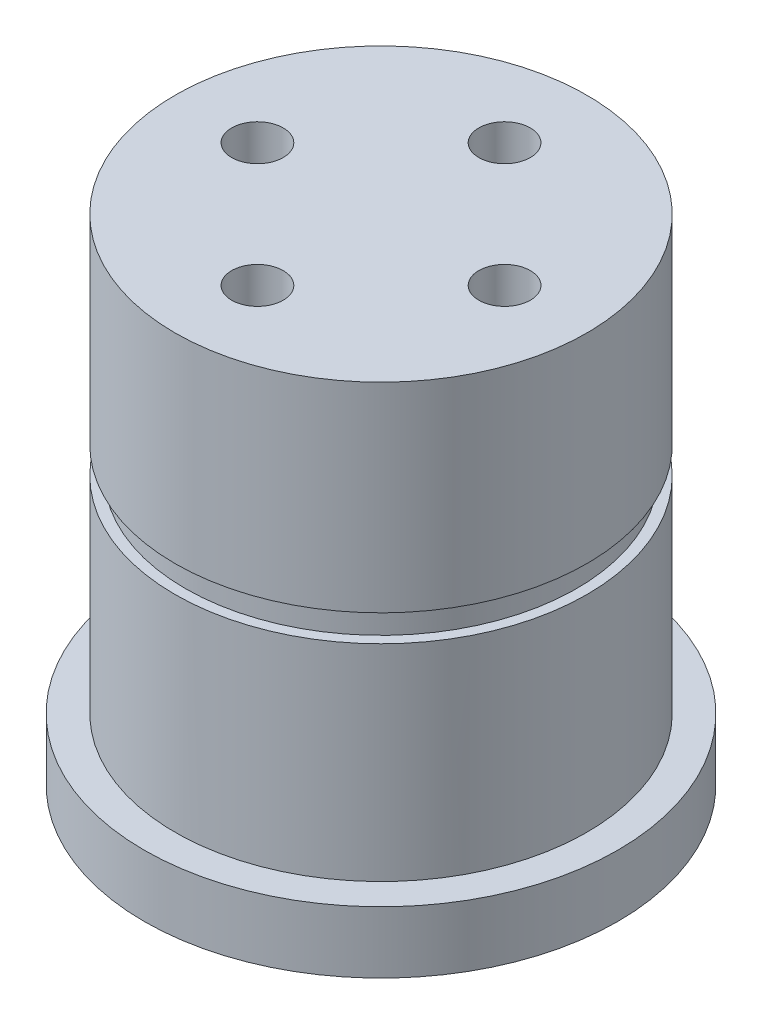
ISO-10303-21;
HEADER;
FILE_DESCRIPTION(('STEP AP214'),'2;1');
FILE_NAME('part.step','',(''),(''),'','','');
FILE_SCHEMA(('AUTOMOTIVE_DESIGN { 1 0 10303 214 1 1 1 1 }'));
ENDSEC;
DATA;
#1=APPLICATION_CONTEXT('core data for automotive mechanical design processes');
#2=APPLICATION_PROTOCOL_DEFINITION('international standard','automotive_design',2000,#1);
#3=PRODUCT_CONTEXT('',#1,'mechanical');
#4=PRODUCT('Part','Part','',(#3));
#5=PRODUCT_RELATED_PRODUCT_CATEGORY('part','',(#4));
#6=PRODUCT_DEFINITION_FORMATION('','',#4);
#7=PRODUCT_DEFINITION_CONTEXT('part definition',#1,'design');
#8=PRODUCT_DEFINITION('design','',#6,#7);
#9=PRODUCT_DEFINITION_SHAPE('','',#8);
#10=(LENGTH_UNIT() NAMED_UNIT(*) SI_UNIT(.MILLI.,.METRE.));
#11=(NAMED_UNIT(*) PLANE_ANGLE_UNIT() SI_UNIT($,.RADIAN.));
#12=(NAMED_UNIT(*) SI_UNIT($,.STERADIAN.) SOLID_ANGLE_UNIT());
#13=UNCERTAINTY_MEASURE_WITH_UNIT(LENGTH_MEASURE(1.E-05),#10,'distance_accuracy_value','');
#14=(GEOMETRIC_REPRESENTATION_CONTEXT(3) GLOBAL_UNCERTAINTY_ASSIGNED_CONTEXT((#13)) GLOBAL_UNIT_ASSIGNED_CONTEXT((#10,
#11,#12)) REPRESENTATION_CONTEXT('',''));
#15=CARTESIAN_POINT('',(0.,0.,0.));
#16=DIRECTION('',(0.,0.,1.));
#17=DIRECTION('',(1.,0.,0.));
#18=AXIS2_PLACEMENT_3D('',#15,#16,#17);
#19=CARTESIAN_POINT('',(0.,24.,0.));
#20=DIRECTION('',(0.,-1.,0.));
#21=DIRECTION('',(0.,0.,-1.));
#22=AXIS2_PLACEMENT_3D('',#19,#20,#21);
#23=CYLINDRICAL_SURFACE('',#22,10.);
#24=CARTESIAN_POINT('',(0.,14.3,0.));
#25=DIRECTION('',(0.,1.,0.));
#26=DIRECTION('',(0.,0.,1.));
#27=AXIS2_PLACEMENT_3D('',#24,#25,#26);
#28=CIRCLE('',#27,10.);
#29=CARTESIAN_POINT('',(0.,14.3,10.));
#30=VERTEX_POINT('',#29);
#31=EDGE_CURVE('E124',#30,#30,#28,.T.);
#32=ORIENTED_EDGE('',*,*,#31,.T.);
#33=EDGE_LOOP('',(#32));
#34=FACE_BOUND('',#33,.T.);
#35=CARTESIAN_POINT('',(0.,24.,0.));
#36=DIRECTION('',(0.,1.,0.));
#37=DIRECTION('',(0.,0.,1.));
#38=AXIS2_PLACEMENT_3D('',#35,#36,#37);
#39=CIRCLE('',#38,10.);
#40=CARTESIAN_POINT('',(0.,24.,10.));
#41=VERTEX_POINT('',#40);
#42=EDGE_CURVE('E47',#41,#41,#39,.T.);
#43=ORIENTED_EDGE('',*,*,#42,.F.);
#44=EDGE_LOOP('',(#43));
#45=FACE_BOUND('',#44,.T.);
#46=ADVANCED_FACE('F40',(#34,#45),#23,.T.);
#47=CARTESIAN_POINT('',(0.,24.,0.));
#48=DIRECTION('',(0.,1.,0.));
#49=DIRECTION('',(0.,0.,1.));
#50=AXIS2_PLACEMENT_3D('',#47,#48,#49);
#51=PLANE('',#50);
#52=CARTESIAN_POINT('',(0.,24.,-6.));
#53=DIRECTION('',(0.,1.,0.));
#54=DIRECTION('',(0.,0.,1.));
#55=AXIS2_PLACEMENT_3D('',#52,#53,#54);
#56=CIRCLE('',#55,1.24999999999999);
#57=CARTESIAN_POINT('',(0.,24.,-4.75000000000001));
#58=VERTEX_POINT('',#57);
#59=EDGE_CURVE('E71',#58,#58,#56,.T.);
#60=ORIENTED_EDGE('',*,*,#59,.F.);
#61=EDGE_LOOP('',(#60));
#62=FACE_BOUND('',#61,.T.);
#63=CARTESIAN_POINT('',(6.,24.,0.));
#64=DIRECTION('',(0.,1.,0.));
#65=DIRECTION('',(0.,0.,1.));
#66=AXIS2_PLACEMENT_3D('',#63,#64,#65);
#67=CIRCLE('',#66,1.24999999999999);
#68=CARTESIAN_POINT('',(6.,24.,1.24999999999999));
#69=VERTEX_POINT('',#68);
#70=EDGE_CURVE('E70',#69,#69,#67,.T.);
#71=ORIENTED_EDGE('',*,*,#70,.F.);
#72=EDGE_LOOP('',(#71));
#73=FACE_BOUND('',#72,.T.);
#74=CARTESIAN_POINT('',(0.,24.,6.));
#75=DIRECTION('',(0.,1.,0.));
#76=DIRECTION('',(0.,0.,1.));
#77=AXIS2_PLACEMENT_3D('',#74,#75,#76);
#78=CIRCLE('',#77,1.24999999999999);
#79=CARTESIAN_POINT('',(0.,24.,7.24999999999999));
#80=VERTEX_POINT('',#79);
#81=EDGE_CURVE('E83',#80,#80,#78,.T.);
#82=ORIENTED_EDGE('',*,*,#81,.F.);
#83=EDGE_LOOP('',(#82));
#84=FACE_BOUND('',#83,.T.);
#85=CARTESIAN_POINT('',(-6.,24.,0.));
#86=DIRECTION('',(0.,1.,0.));
#87=DIRECTION('',(0.,0.,1.));
#88=AXIS2_PLACEMENT_3D('',#85,#86,#87);
#89=CIRCLE('',#88,1.24999999999999);
#90=CARTESIAN_POINT('',(-6.,24.,1.24999999999999));
#91=VERTEX_POINT('',#90);
#92=EDGE_CURVE('E89',#91,#91,#89,.T.);
#93=ORIENTED_EDGE('',*,*,#92,.F.);
#94=EDGE_LOOP('',(#93));
#95=FACE_BOUND('',#94,.T.);
#96=ORIENTED_EDGE('',*,*,#42,.T.);
#97=EDGE_LOOP('',(#96));
#98=FACE_BOUND('',#97,.T.);
#99=ADVANCED_FACE('F97',(#62,#73,#84,#95,#98),#51,.T.);
#100=CARTESIAN_POINT('',(-6.,15.5,0.));
#101=DIRECTION('',(0.,1.,0.));
#102=DIRECTION('',(0.,0.,1.));
#103=AXIS2_PLACEMENT_3D('',#100,#101,#102);
#104=CONICAL_SURFACE('',#103,1.24999999999999,1.02974425867665);
#105=CARTESIAN_POINT('',(-6.,14.7489242262156,0.));
#106=VERTEX_POINT('',#105);
#107=VERTEX_LOOP('',#106);
#108=FACE_BOUND('',#107,.T.);
#109=CARTESIAN_POINT('',(-6.,15.5,0.));
#110=DIRECTION('',(0.,1.,0.));
#111=DIRECTION('',(0.,0.,1.));
#112=AXIS2_PLACEMENT_3D('',#109,#110,#111);
#113=CIRCLE('',#112,1.24999999999999);
#114=CARTESIAN_POINT('',(-6.,15.5,1.24999999999999));
#115=VERTEX_POINT('',#114);
#116=EDGE_CURVE('E92',#115,#115,#113,.T.);
#117=ORIENTED_EDGE('',*,*,#116,.T.);
#118=EDGE_LOOP('',(#117));
#119=FACE_BOUND('',#118,.T.);
#120=ADVANCED_FACE('F105',(#108,#119),#104,.F.);
#121=CARTESIAN_POINT('',(-6.,24.,0.));
#122=DIRECTION('',(0.,1.,0.));
#123=DIRECTION('',(0.,0.,1.));
#124=AXIS2_PLACEMENT_3D('',#121,#122,#123);
#125=CYLINDRICAL_SURFACE('',#124,1.24999999999999);
#126=ORIENTED_EDGE('',*,*,#116,.F.);
#127=EDGE_LOOP('',(#126));
#128=FACE_BOUND('',#127,.T.);
#129=ORIENTED_EDGE('',*,*,#92,.T.);
#130=EDGE_LOOP('',(#129));
#131=FACE_BOUND('',#130,.T.);
#132=ADVANCED_FACE('F154',(#128,#131),#125,.F.);
#133=CARTESIAN_POINT('',(0.,15.5,6.));
#134=DIRECTION('',(0.,1.,0.));
#135=DIRECTION('',(0.,0.,1.));
#136=AXIS2_PLACEMENT_3D('',#133,#134,#135);
#137=CONICAL_SURFACE('',#136,1.24999999999999,1.02974425867665);
#138=CARTESIAN_POINT('',(0.,14.7489242262156,6.));
#139=VERTEX_POINT('',#138);
#140=VERTEX_LOOP('',#139);
#141=FACE_BOUND('',#140,.T.);
#142=CARTESIAN_POINT('',(0.,15.5,6.));
#143=DIRECTION('',(0.,1.,0.));
#144=DIRECTION('',(0.,0.,1.));
#145=AXIS2_PLACEMENT_3D('',#142,#143,#144);
#146=CIRCLE('',#145,1.24999999999999);
#147=CARTESIAN_POINT('',(0.,15.5,7.24999999999999));
#148=VERTEX_POINT('',#147);
#149=EDGE_CURVE('E86',#148,#148,#146,.T.);
#150=ORIENTED_EDGE('',*,*,#149,.T.);
#151=EDGE_LOOP('',(#150));
#152=FACE_BOUND('',#151,.T.);
#153=ADVANCED_FACE('F157',(#141,#152),#137,.F.);
#154=CARTESIAN_POINT('',(0.,24.,6.));
#155=DIRECTION('',(0.,1.,0.));
#156=DIRECTION('',(0.,0.,1.));
#157=AXIS2_PLACEMENT_3D('',#154,#155,#156);
#158=CYLINDRICAL_SURFACE('',#157,1.24999999999999);
#159=ORIENTED_EDGE('',*,*,#149,.F.);
#160=EDGE_LOOP('',(#159));
#161=FACE_BOUND('',#160,.T.);
#162=ORIENTED_EDGE('',*,*,#81,.T.);
#163=EDGE_LOOP('',(#162));
#164=FACE_BOUND('',#163,.T.);
#165=ADVANCED_FACE('F161',(#161,#164),#158,.F.);
#166=CARTESIAN_POINT('',(6.,15.5,0.));
#167=DIRECTION('',(0.,1.,0.));
#168=DIRECTION('',(0.,0.,1.));
#169=AXIS2_PLACEMENT_3D('',#166,#167,#168);
#170=CONICAL_SURFACE('',#169,1.24999999999999,1.02974425867665);
#171=CARTESIAN_POINT('',(6.,14.7489242262156,0.));
#172=VERTEX_POINT('',#171);
#173=VERTEX_LOOP('',#172);
#174=FACE_BOUND('',#173,.T.);
#175=CARTESIAN_POINT('',(6.,15.5,0.));
#176=DIRECTION('',(0.,1.,0.));
#177=DIRECTION('',(0.,0.,1.));
#178=AXIS2_PLACEMENT_3D('',#175,#176,#177);
#179=CIRCLE('',#178,1.24999999999999);
#180=CARTESIAN_POINT('',(6.,15.5,1.24999999999999));
#181=VERTEX_POINT('',#180);
#182=EDGE_CURVE('E74',#181,#181,#179,.T.);
#183=ORIENTED_EDGE('',*,*,#182,.T.);
#184=EDGE_LOOP('',(#183));
#185=FACE_BOUND('',#184,.T.);
#186=ADVANCED_FACE('F164',(#174,#185),#170,.F.);
#187=CARTESIAN_POINT('',(6.,24.,0.));
#188=DIRECTION('',(0.,1.,0.));
#189=DIRECTION('',(0.,0.,1.));
#190=AXIS2_PLACEMENT_3D('',#187,#188,#189);
#191=CYLINDRICAL_SURFACE('',#190,1.24999999999999);
#192=ORIENTED_EDGE('',*,*,#182,.F.);
#193=EDGE_LOOP('',(#192));
#194=FACE_BOUND('',#193,.T.);
#195=ORIENTED_EDGE('',*,*,#70,.T.);
#196=EDGE_LOOP('',(#195));
#197=FACE_BOUND('',#196,.T.);
#198=ADVANCED_FACE('F64',(#194,#197),#191,.F.);
#199=CARTESIAN_POINT('',(0.,15.5,-6.));
#200=DIRECTION('',(0.,1.,0.));
#201=DIRECTION('',(0.,0.,1.));
#202=AXIS2_PLACEMENT_3D('',#199,#200,#201);
#203=CONICAL_SURFACE('',#202,1.24999999999999,1.02974425867665);
#204=CARTESIAN_POINT('',(0.,14.7489242262156,-6.));
#205=VERTEX_POINT('',#204);
#206=VERTEX_LOOP('',#205);
#207=FACE_BOUND('',#206,.T.);
#208=CARTESIAN_POINT('',(0.,15.5,-6.));
#209=DIRECTION('',(0.,1.,0.));
#210=DIRECTION('',(0.,0.,1.));
#211=AXIS2_PLACEMENT_3D('',#208,#209,#210);
#212=CIRCLE('',#211,1.24999999999999);
#213=CARTESIAN_POINT('',(0.,15.5,-4.75000000000001));
#214=VERTEX_POINT('',#213);
#215=EDGE_CURVE('E68',#214,#214,#212,.T.);
#216=ORIENTED_EDGE('',*,*,#215,.T.);
#217=EDGE_LOOP('',(#216));
#218=FACE_BOUND('',#217,.T.);
#219=ADVANCED_FACE('F60',(#207,#218),#203,.F.);
#220=CARTESIAN_POINT('',(0.,24.,-6.));
#221=DIRECTION('',(0.,1.,0.));
#222=DIRECTION('',(0.,0.,1.));
#223=AXIS2_PLACEMENT_3D('',#220,#221,#222);
#224=CYLINDRICAL_SURFACE('',#223,1.24999999999999);
#225=ORIENTED_EDGE('',*,*,#215,.F.);
#226=EDGE_LOOP('',(#225));
#227=FACE_BOUND('',#226,.T.);
#228=ORIENTED_EDGE('',*,*,#59,.T.);
#229=EDGE_LOOP('',(#228));
#230=FACE_BOUND('',#229,.T.);
#231=ADVANCED_FACE('F63',(#227,#230),#224,.F.);
#232=CARTESIAN_POINT('',(0.,14.3,0.));
#233=DIRECTION('',(0.,1.,0.));
#234=DIRECTION('',(0.,0.,1.));
#235=AXIS2_PLACEMENT_3D('',#232,#233,#234);
#236=PLANE('',#235);
#237=ORIENTED_EDGE('',*,*,#31,.F.);
#238=EDGE_LOOP('',(#237));
#239=FACE_BOUND('',#238,.T.);
#240=CARTESIAN_POINT('',(0.,14.3,0.));
#241=DIRECTION('',(0.,1.,0.));
#242=DIRECTION('',(0.,0.,1.));
#243=AXIS2_PLACEMENT_3D('',#240,#241,#242);
#244=CIRCLE('',#243,9.5);
#245=CARTESIAN_POINT('',(0.,14.3,9.5));
#246=VERTEX_POINT('',#245);
#247=EDGE_CURVE('E125',#246,#246,#244,.T.);
#248=ORIENTED_EDGE('',*,*,#247,.T.);
#249=EDGE_LOOP('',(#248));
#250=FACE_BOUND('',#249,.T.);
#251=ADVANCED_FACE('F173',(#239,#250),#236,.F.);
#252=CARTESIAN_POINT('',(0.,13.,0.));
#253=DIRECTION('',(0.,1.,0.));
#254=DIRECTION('',(0.,0.,1.));
#255=AXIS2_PLACEMENT_3D('',#252,#253,#254);
#256=PLANE('',#255);
#257=CARTESIAN_POINT('',(0.,13.,0.));
#258=DIRECTION('',(0.,1.,0.));
#259=DIRECTION('',(0.,0.,1.));
#260=AXIS2_PLACEMENT_3D('',#257,#258,#259);
#261=CIRCLE('',#260,10.);
#262=CARTESIAN_POINT('',(0.,13.,10.));
#263=VERTEX_POINT('',#262);
#264=EDGE_CURVE('E122',#263,#263,#261,.T.);
#265=ORIENTED_EDGE('',*,*,#264,.T.);
#266=EDGE_LOOP('',(#265));
#267=FACE_BOUND('',#266,.T.);
#268=CARTESIAN_POINT('',(0.,13.,0.));
#269=DIRECTION('',(0.,1.,0.));
#270=DIRECTION('',(0.,0.,1.));
#271=AXIS2_PLACEMENT_3D('',#268,#269,#270);
#272=CIRCLE('',#271,9.5);
#273=CARTESIAN_POINT('',(0.,13.,9.5));
#274=VERTEX_POINT('',#273);
#275=EDGE_CURVE('E130',#274,#274,#272,.T.);
#276=ORIENTED_EDGE('',*,*,#275,.F.);
#277=EDGE_LOOP('',(#276));
#278=FACE_BOUND('',#277,.T.);
#279=ADVANCED_FACE('F148',(#267,#278),#256,.T.);
#280=CARTESIAN_POINT('',(0.,14.3,0.));
#281=DIRECTION('',(0.,-1.,0.));
#282=DIRECTION('',(0.,0.,-1.));
#283=AXIS2_PLACEMENT_3D('',#280,#281,#282);
#284=CYLINDRICAL_SURFACE('',#283,9.5);
#285=ORIENTED_EDGE('',*,*,#247,.F.);
#286=EDGE_LOOP('',(#285));
#287=FACE_BOUND('',#286,.T.);
#288=ORIENTED_EDGE('',*,*,#275,.T.);
#289=EDGE_LOOP('',(#288));
#290=FACE_BOUND('',#289,.T.);
#291=ADVANCED_FACE('F142',(#287,#290),#284,.T.);
#292=CARTESIAN_POINT('',(0.,0.,0.));
#293=DIRECTION('',(0.,1.,0.));
#294=DIRECTION('',(0.,0.,1.));
#295=AXIS2_PLACEMENT_3D('',#292,#293,#294);
#296=PLANE('',#295);
#297=CARTESIAN_POINT('',(0.,0.,0.));
#298=DIRECTION('',(0.,1.,0.));
#299=DIRECTION('',(0.,0.,1.));
#300=AXIS2_PLACEMENT_3D('',#297,#298,#299);
#301=CIRCLE('',#300,11.5);
#302=CARTESIAN_POINT('',(0.,0.,11.5));
#303=VERTEX_POINT('',#302);
#304=EDGE_CURVE('E127',#303,#303,#301,.T.);
#305=ORIENTED_EDGE('',*,*,#304,.F.);
#306=EDGE_LOOP('',(#305));
#307=FACE_BOUND('',#306,.T.);
#308=ADVANCED_FACE('F140',(#307),#296,.F.);
#309=CARTESIAN_POINT('',(0.,-32.5269119345812,0.));
#310=DIRECTION('',(0.,1.,0.));
#311=DIRECTION('',(0.,0.,1.));
#312=AXIS2_PLACEMENT_3D('',#309,#310,#311);
#313=CYLINDRICAL_SURFACE('',#312,11.5);
#314=CARTESIAN_POINT('',(0.,3.,0.));
#315=DIRECTION('',(0.,-1.,0.));
#316=DIRECTION('',(0.,0.,-1.));
#317=AXIS2_PLACEMENT_3D('',#314,#315,#316);
#318=CIRCLE('',#317,11.5);
#319=CARTESIAN_POINT('',(0.,3.,11.5));
#320=VERTEX_POINT('',#319);
#321=EDGE_CURVE('E77',#320,#320,#318,.T.);
#322=CARTESIAN_POINT('',(0.,0.,11.5));
#323=CARTESIAN_POINT('',(0.,0.0312499999999942,11.5));
#324=CARTESIAN_POINT('',(0.,0.0624999999999954,11.5));
#325=CARTESIAN_POINT('',(0.,0.124999999999995,11.5));
#326=CARTESIAN_POINT('',(0.,0.156249999999994,11.5));
#327=CARTESIAN_POINT('',(0.,0.218749999999992,11.5));
#328=CARTESIAN_POINT('',(0.,0.249999999999991,11.5));
#329=CARTESIAN_POINT('',(0.,0.312499999999991,11.5));
#330=CARTESIAN_POINT('',(0.,0.343749999999992,11.5));
#331=CARTESIAN_POINT('',(0.,0.406249999999995,11.5));
#332=CARTESIAN_POINT('',(0.,0.437499999999996,11.5));
#333=CARTESIAN_POINT('',(0.,0.499999999999996,11.5));
#334=CARTESIAN_POINT('',(0.,0.531249999999995,11.5));
#335=CARTESIAN_POINT('',(0.,0.593749999999992,11.5));
#336=CARTESIAN_POINT('',(0.,0.624999999999991,11.5));
#337=CARTESIAN_POINT('',(0.,0.687499999999991,11.5));
#338=CARTESIAN_POINT('',(0.,0.718749999999993,11.5));
#339=CARTESIAN_POINT('',(0.,0.781249999999995,11.5));
#340=CARTESIAN_POINT('',(0.,0.812499999999996,11.5));
#341=CARTESIAN_POINT('',(0.,0.874999999999996,11.5));
#342=CARTESIAN_POINT('',(0.,0.906249999999995,11.5));
#343=CARTESIAN_POINT('',(0.,0.968749999999993,11.5));
#344=CARTESIAN_POINT('',(0.,0.999999999999992,11.5));
#345=CARTESIAN_POINT('',(0.,1.06249999999999,11.5));
#346=CARTESIAN_POINT('',(0.,1.09374999999999,11.5));
#347=CARTESIAN_POINT('',(0.,1.15625,11.5));
#348=CARTESIAN_POINT('',(0.,1.1875,11.5));
#349=CARTESIAN_POINT('',(0.,1.25,11.5));
#350=CARTESIAN_POINT('',(0.,1.28125,11.5));
#351=CARTESIAN_POINT('',(0.,1.34374999999999,11.5));
#352=CARTESIAN_POINT('',(0.,1.37499999999999,11.5));
#353=CARTESIAN_POINT('',(0.,1.43749999999999,11.5));
#354=CARTESIAN_POINT('',(0.,1.46874999999999,11.5));
#355=CARTESIAN_POINT('',(0.,1.53125,11.5));
#356=CARTESIAN_POINT('',(0.,1.5625,11.5));
#357=CARTESIAN_POINT('',(0.,1.625,11.5));
#358=CARTESIAN_POINT('',(0.,1.65625,11.5));
#359=CARTESIAN_POINT('',(0.,1.71874999999999,11.5));
#360=CARTESIAN_POINT('',(0.,1.74999999999999,11.5));
#361=CARTESIAN_POINT('',(0.,1.81249999999999,11.5));
#362=CARTESIAN_POINT('',(0.,1.84374999999999,11.5));
#363=CARTESIAN_POINT('',(0.,1.90625,11.5));
#364=CARTESIAN_POINT('',(0.,1.9375,11.5));
#365=CARTESIAN_POINT('',(0.,2.,11.5));
#366=CARTESIAN_POINT('',(0.,2.03125,11.5));
#367=CARTESIAN_POINT('',(0.,2.09374999999999,11.5));
#368=CARTESIAN_POINT('',(0.,2.12499999999999,11.5));
#369=CARTESIAN_POINT('',(0.,2.18749999999999,11.5));
#370=CARTESIAN_POINT('',(0.,2.21874999999999,11.5));
#371=CARTESIAN_POINT('',(0.,2.28125,11.5));
#372=CARTESIAN_POINT('',(0.,2.3125,11.5));
#373=CARTESIAN_POINT('',(0.,2.375,11.5));
#374=CARTESIAN_POINT('',(0.,2.40625,11.5));
#375=CARTESIAN_POINT('',(0.,2.46874999999999,11.5));
#376=CARTESIAN_POINT('',(0.,2.49999999999999,11.5));
#377=CARTESIAN_POINT('',(0.,2.56249999999999,11.5));
#378=CARTESIAN_POINT('',(0.,2.59374999999999,11.5));
#379=CARTESIAN_POINT('',(0.,2.65625,11.5));
#380=CARTESIAN_POINT('',(0.,2.6875,11.5));
#381=CARTESIAN_POINT('',(0.,2.75,11.5));
#382=CARTESIAN_POINT('',(0.,2.78125,11.5));
#383=CARTESIAN_POINT('',(0.,2.84374999999999,11.5));
#384=CARTESIAN_POINT('',(0.,2.87499999999999,11.5));
#385=CARTESIAN_POINT('',(0.,2.93749999999999,11.5));
#386=CARTESIAN_POINT('',(0.,2.96874999999999,11.5));
#387=CARTESIAN_POINT('',(0.,3.,11.5));
#388=B_SPLINE_CURVE_WITH_KNOTS('',3,(#322,#323,#324,#325,#326,#327,#328,#329,#330,#331,#332,
#333,#334,#335,#336,#337,#338,#339,#340,#341,#342,#343,#344,#345,#346,#347,#348,#349,#350,#351,
#352,#353,#354,#355,#356,#357,#358,#359,#360,#361,#362,#363,#364,#365,#366,#367,#368,#369,#370,
#371,#372,#373,#374,#375,#376,#377,#378,#379,#380,#381,#382,#383,#384,#385,#386,#387),
.UNSPECIFIED.,.F.,.F.,(4,2,2,2,2,2,2,2,2,2,2,2,2,2,2,2,2,2,2,2,2,2,2,2,2,2,2,2,2,2,2,2,4),(0.,
0.0937500000000036,0.1875,0.281249999999997,0.375,0.468750000000004,0.5625,0.656249999999997,
0.750000000000001,0.843750000000004,0.937500000000001,1.03125,1.125,1.21875,1.3125,1.40625,1.5,
1.59375,1.6875,1.78125,1.875,1.96875000000001,2.0625,2.15625,2.25,2.34375000000001,2.4375,
2.53125,2.625,2.71875000000001,2.8125,2.90625,3.),.UNSPECIFIED.);
#389=EDGE_CURVE('BSEAM115',#303,#320,#388,.T.);
#390=ORIENTED_EDGE('',*,*,#304,.T.);
#391=ORIENTED_EDGE('',*,*,#321,.T.);
#392=ORIENTED_EDGE('',*,*,#389,.T.);
#393=ORIENTED_EDGE('',*,*,#389,.F.);
#394=EDGE_LOOP('',(#390,#392,#391,#393));
#395=FACE_BOUND('',#394,.T.);
#396=ADVANCED_FACE('F115',(#395),#313,.T.);
#397=CARTESIAN_POINT('',(0.,3.,0.));
#398=DIRECTION('',(0.,-1.,0.));
#399=DIRECTION('',(0.,0.,-1.));
#400=AXIS2_PLACEMENT_3D('',#397,#398,#399);
#401=PLANE('',#400);
#402=ORIENTED_EDGE('',*,*,#321,.F.);
#403=EDGE_LOOP('',(#402));
#404=FACE_BOUND('',#403,.T.);
#405=CARTESIAN_POINT('',(0.,3.,0.));
#406=DIRECTION('',(0.,-1.,0.));
#407=DIRECTION('',(0.,0.,-1.));
#408=AXIS2_PLACEMENT_3D('',#405,#406,#407);
#409=CIRCLE('',#408,10.);
#410=CARTESIAN_POINT('',(0.,3.,-10.));
#411=VERTEX_POINT('',#410);
#412=EDGE_CURVE('E11',#411,#411,#409,.T.);
#413=ORIENTED_EDGE('',*,*,#412,.T.);
#414=EDGE_LOOP('',(#413));
#415=FACE_BOUND('',#414,.T.);
#416=ADVANCED_FACE('F110',(#404,#415),#401,.F.);
#417=ORIENTED_EDGE('',*,*,#412,.F.);
#418=EDGE_LOOP('',(#417));
#419=FACE_BOUND('',#418,.T.);
#420=ORIENTED_EDGE('',*,*,#264,.F.);
#421=EDGE_LOOP('',(#420));
#422=FACE_BOUND('',#421,.T.);
#423=ADVANCED_FACE('F101',(#419,#422),#23,.T.);
#424=CLOSED_SHELL('',(#46,#99,#120,#132,#153,#165,#186,#198,#219,#231,#251,#279,#291,#308,#396,
#416,#423));
#425=MANIFOLD_SOLID_BREP('B2',#424);
#426=ADVANCED_BREP_SHAPE_REPRESENTATION('',(#18,#425),#14);
#427=SHAPE_DEFINITION_REPRESENTATION(#9,#426);
ENDSEC;
END-ISO-10303-21;
